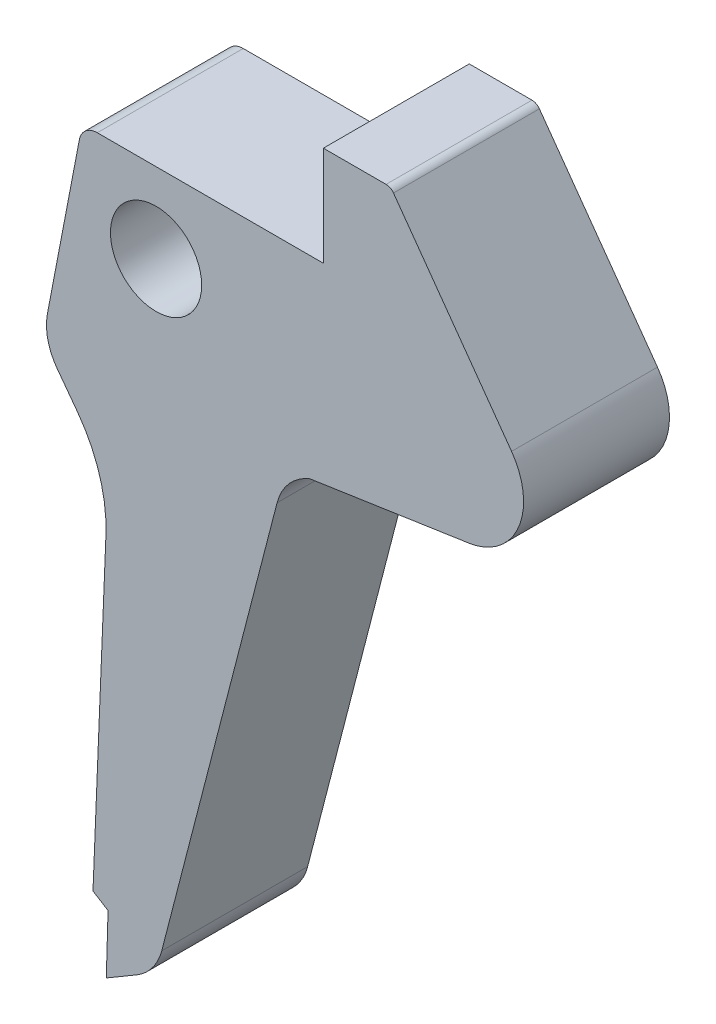
ISO-10303-21;
HEADER;
FILE_DESCRIPTION(('STEP AP214'),'2;1');
FILE_NAME('part.step','',(''),(''),'','','');
FILE_SCHEMA(('AUTOMOTIVE_DESIGN { 1 0 10303 214 1 1 1 1 }'));
ENDSEC;
DATA;
#1=APPLICATION_CONTEXT('core data for automotive mechanical design processes');
#2=APPLICATION_PROTOCOL_DEFINITION('international standard','automotive_design',2000,#1);
#3=PRODUCT_CONTEXT('',#1,'mechanical');
#4=PRODUCT('Part','Part','',(#3));
#5=PRODUCT_RELATED_PRODUCT_CATEGORY('part','',(#4));
#6=PRODUCT_DEFINITION_FORMATION('','',#4);
#7=PRODUCT_DEFINITION_CONTEXT('part definition',#1,'design');
#8=PRODUCT_DEFINITION('design','',#6,#7);
#9=PRODUCT_DEFINITION_SHAPE('','',#8);
#10=(LENGTH_UNIT() NAMED_UNIT(*) SI_UNIT(.MILLI.,.METRE.));
#11=(NAMED_UNIT(*) PLANE_ANGLE_UNIT() SI_UNIT($,.RADIAN.));
#12=(NAMED_UNIT(*) SI_UNIT($,.STERADIAN.) SOLID_ANGLE_UNIT());
#13=UNCERTAINTY_MEASURE_WITH_UNIT(LENGTH_MEASURE(1.E-05),#10,'distance_accuracy_value','');
#14=(GEOMETRIC_REPRESENTATION_CONTEXT(3) GLOBAL_UNCERTAINTY_ASSIGNED_CONTEXT((#13)) GLOBAL_UNIT_ASSIGNED_CONTEXT((#10,
#11,#12)) REPRESENTATION_CONTEXT('',''));
#15=CARTESIAN_POINT('',(0.,0.,0.));
#16=DIRECTION('',(0.,0.,1.));
#17=DIRECTION('',(1.,0.,0.));
#18=AXIS2_PLACEMENT_3D('',#15,#16,#17);
#19=CARTESIAN_POINT('',(-27.5386496965581,20.5124527591258,8.));
#20=DIRECTION('',(0.,0.,-1.));
#21=DIRECTION('',(-1.,0.,0.));
#22=AXIS2_PLACEMENT_3D('',#19,#20,#21);
#23=CYLINDRICAL_SURFACE('',#22,3.51622024287723);
#24=CARTESIAN_POINT('',(-27.0186324334958,17.0348980374087,3.44779673254734));
#25=CARTESIAN_POINT('',(-27.0031138732111,17.0372310651788,3.50906492681584));
#26=CARTESIAN_POINT('',(-26.9901875644307,17.039258326073,3.57100285618573));
#27=CARTESIAN_POINT('',(-26.9695834994203,17.0425679286272,3.69578846759355));
#28=CARTESIAN_POINT('',(-26.9619076690804,17.0438499969226,3.75863647482813));
#29=CARTESIAN_POINT('',(-26.9519837782461,17.0455165090996,3.88346269906473));
#30=CARTESIAN_POINT('',(-26.9496267500831,17.0459189682313,3.94543202422761));
#31=CARTESIAN_POINT('',(-26.9500339387754,17.0458497223223,4.0693246993472));
#32=CARTESIAN_POINT('',(-26.9527957353733,17.0453784304042,4.1312480571897));
#33=CARTESIAN_POINT('',(-26.9632939928981,17.0436197134707,4.2532132957871));
#34=CARTESIAN_POINT('',(-26.9709138009196,17.0423514360426,4.31326554481595));
#35=CARTESIAN_POINT('',(-26.991060045547,17.0391206572248,4.43315978042355));
#36=CARTESIAN_POINT('',(-27.0036362392181,17.0371511360571,4.49299322207267));
#37=CARTESIAN_POINT('',(-27.0186324334958,17.0348980374087,4.55220326745266));
#38=B_SPLINE_CURVE_WITH_KNOTS('',3,(#24,#25,#26,#27,#28,#29,#30,#31,#32,#33,#34,#35,#36,#37),
.UNSPECIFIED.,.F.,.F.,(4,2,2,2,2,2,4),(0.,0.189684137179738,0.379437813770707,0.565267233862551,
0.751008813421791,0.932450136246781,1.11576134286116),.UNSPECIFIED.);
#39=CARTESIAN_POINT('',(-27.0186324334958,17.0348980374087,3.4477967325474));
#40=VERTEX_POINT('',#39);
#41=CARTESIAN_POINT('',(-27.0186324334958,17.0348980374087,4.55220326745266));
#42=VERTEX_POINT('',#41);
#43=EDGE_CURVE('E297',#40,#42,#38,.T.);
#44=ORIENTED_EDGE('',*,*,#43,.F.);
#45=DIRECTION('',(0.,0.,-1.));
#46=VECTOR('',#45,1.);
#47=CARTESIAN_POINT('',(-27.0186324334958,17.0348980374087,8.));
#48=LINE('',#47,#46);
#49=CARTESIAN_POINT('',(-27.0186324334958,17.0348980374087,0.));
#50=VERTEX_POINT('',#49);
#51=EDGE_CURVE('E252',#40,#50,#48,.T.);
#52=ORIENTED_EDGE('',*,*,#51,.T.);
#53=CARTESIAN_POINT('',(-27.5386496965581,20.5124527591258,0.));
#54=DIRECTION('',(0.,0.,1.));
#55=DIRECTION('',(1.,0.,0.));
#56=AXIS2_PLACEMENT_3D('',#53,#54,#55);
#57=CIRCLE('',#56,3.51622024287723);
#58=CARTESIAN_POINT('',(-24.6810608376861,22.5613526371263,0.));
#59=VERTEX_POINT('',#58);
#60=EDGE_CURVE('E242',#50,#59,#57,.T.);
#61=ORIENTED_EDGE('',*,*,#60,.T.);
#62=DIRECTION('',(0.,0.,-1.));
#63=VECTOR('',#62,1.);
#64=CARTESIAN_POINT('',(-24.6810608376861,22.5613526371263,8.));
#65=LINE('',#64,#63);
#66=CARTESIAN_POINT('',(-24.6810608376861,22.5613526371263,8.));
#67=VERTEX_POINT('',#66);
#68=EDGE_CURVE('E200',#67,#59,#65,.T.);
#69=ORIENTED_EDGE('',*,*,#68,.F.);
#70=CARTESIAN_POINT('',(-27.5386496965581,20.5124527591258,8.));
#71=DIRECTION('',(0.,0.,1.));
#72=DIRECTION('',(1.,0.,0.));
#73=AXIS2_PLACEMENT_3D('',#70,#71,#72);
#74=CIRCLE('',#73,3.51622024287723);
#75=CARTESIAN_POINT('',(-27.0186324334958,17.0348980374087,8.));
#76=VERTEX_POINT('',#75);
#77=EDGE_CURVE('E188',#76,#67,#74,.T.);
#78=ORIENTED_EDGE('',*,*,#77,.F.);
#79=EDGE_CURVE('E253',#76,#42,#48,.T.);
#80=ORIENTED_EDGE('',*,*,#79,.T.);
#81=EDGE_LOOP('',(#44,#52,#61,#69,#78,#80));
#82=FACE_BOUND('',#81,.T.);
#83=ADVANCED_FACE('F35',(#82),#23,.T.);
#84=CARTESIAN_POINT('',(-31.5622031088188,31.3003669545744,8.));
#85=DIRECTION('',(0.,0.,1.));
#86=DIRECTION('',(1.,0.,0.));
#87=AXIS2_PLACEMENT_3D('',#84,#85,#86);
#88=PLANE('',#87);
#89=DIRECTION('',(0.,-1.,0.));
#90=VECTOR('',#89,1.);
#91=CARTESIAN_POINT('',(-35.0008358346746,26.3358212656036,8.));
#92=LINE('',#91,#90);
#93=CARTESIAN_POINT('',(-35.0008358346746,31.8003669545744,8.));
#94=VERTEX_POINT('',#93);
#95=CARTESIAN_POINT('',(-35.0008358346746,26.3358212656036,8.));
#96=VERTEX_POINT('',#95);
#97=EDGE_CURVE('E248',#94,#96,#92,.T.);
#98=ORIENTED_EDGE('',*,*,#97,.T.);
#99=DIRECTION('',(-1.,0.,0.));
#100=VECTOR('',#99,1.);
#101=CARTESIAN_POINT('',(-47.3957580318435,26.3358212656036,8.));
#102=LINE('',#101,#100);
#103=CARTESIAN_POINT('',(-47.3957580318435,26.3358212656036,8.));
#104=VERTEX_POINT('',#103);
#105=EDGE_CURVE('E133',#96,#104,#102,.T.);
#106=ORIENTED_EDGE('',*,*,#105,.T.);
#107=CARTESIAN_POINT('',(-47.3957580318435,25.3358212656036,8.));
#108=DIRECTION('',(0.,0.,1.));
#109=DIRECTION('',(-1.,0.,0.));
#110=AXIS2_PLACEMENT_3D('',#107,#108,#109);
#111=CIRCLE('',#110,1.);
#112=CARTESIAN_POINT('',(-48.3778873221714,25.5240287497269,8.));
#113=VERTEX_POINT('',#112);
#114=EDGE_CURVE('E376',#104,#113,#111,.T.);
#115=ORIENTED_EDGE('',*,*,#114,.T.);
#116=DIRECTION('',(-0.188207484123293,-0.982129290327898,0.));
#117=VECTOR('',#116,1.);
#118=CARTESIAN_POINT('',(-50.1299712502546,16.3810716941188,8.));
#119=LINE('',#118,#117);
#120=CARTESIAN_POINT('',(-50.1299712502546,16.3810716941188,8.));
#121=VERTEX_POINT('',#120);
#122=EDGE_CURVE('E374',#113,#121,#119,.T.);
#123=ORIENTED_EDGE('',*,*,#122,.T.);
#124=CARTESIAN_POINT('',(-47.1835833792709,15.816449241749,8.));
#125=DIRECTION('',(0.,0.,1.));
#126=DIRECTION('',(1.,0.,0.));
#127=AXIS2_PLACEMENT_3D('',#124,#125,#126);
#128=CIRCLE('',#127,3.);
#129=CARTESIAN_POINT('',(-49.5888436325412,14.0234843469341,8.));
#130=VERTEX_POINT('',#129);
#131=EDGE_CURVE('E372',#121,#130,#128,.T.);
#132=ORIENTED_EDGE('',*,*,#131,.T.);
#133=DIRECTION('',(0.597654964938284,-0.801753417756743,0.));
#134=VECTOR('',#133,1.);
#135=CARTESIAN_POINT('',(-48.5024211660002,12.5660499127253,8.));
#136=LINE('',#135,#134);
#137=CARTESIAN_POINT('',(-48.5024211660002,12.5660499127253,8.));
#138=VERTEX_POINT('',#137);
#139=EDGE_CURVE('E370',#130,#138,#136,.T.);
#140=ORIENTED_EDGE('',*,*,#139,.T.);
#141=CARTESIAN_POINT('',(-54.9164485080541,7.78481019321899,8.));
#142=DIRECTION('',(0.,0.,-1.));
#143=DIRECTION('',(1.,0.,0.));
#144=AXIS2_PLACEMENT_3D('',#141,#142,#143);
#145=CIRCLE('',#144,8.);
#146=CARTESIAN_POINT('',(-46.9232095093678,7.45597845831508,8.));
#147=VERTEX_POINT('',#146);
#148=EDGE_CURVE('E368',#138,#147,#145,.T.);
#149=ORIENTED_EDGE('',*,*,#148,.T.);
#150=DIRECTION('',(-0.0411039668629871,-0.999154874835792,0.));
#151=VECTOR('',#150,1.);
#152=CARTESIAN_POINT('',(-47.6327122192142,-9.79060734239905,8.));
#153=LINE('',#152,#151);
#154=CARTESIAN_POINT('',(-47.6327122192142,-9.79060734239905,8.));
#155=VERTEX_POINT('',#154);
#156=EDGE_CURVE('E366',#147,#155,#153,.T.);
#157=ORIENTED_EDGE('',*,*,#156,.T.);
#158=DIRECTION('',(0.849229113679136,-0.528024537762923,0.));
#159=VECTOR('',#158,1.);
#160=CARTESIAN_POINT('',(-46.8065771363626,-10.3042727222429,8.));
#161=LINE('',#160,#159);
#162=CARTESIAN_POINT('',(-46.8065771363626,-10.3042727222429,8.));
#163=VERTEX_POINT('',#162);
#164=EDGE_CURVE('E364',#155,#163,#161,.T.);
#165=ORIENTED_EDGE('',*,*,#164,.T.);
#166=DIRECTION('',(-0.0295106794911616,-0.99956446505264,0.));
#167=VECTOR('',#166,1.);
#168=CARTESIAN_POINT('',(-46.9025588606,-13.5552965040206,8.));
#169=LINE('',#168,#167);
#170=CARTESIAN_POINT('',(-46.9025588606,-13.5552965040206,8.));
#171=VERTEX_POINT('',#170);
#172=EDGE_CURVE('E362',#163,#171,#169,.T.);
#173=ORIENTED_EDGE('',*,*,#172,.T.);
#174=DIRECTION('',(0.861711984884144,0.507397728716861,0.));
#175=VECTOR('',#174,1.);
#176=CARTESIAN_POINT('',(-45.245148695036,-12.5793716378109,8.));
#177=LINE('',#176,#175);
#178=CARTESIAN_POINT('',(-45.245148695036,-12.5793716378109,8.));
#179=VERTEX_POINT('',#178);
#180=EDGE_CURVE('E360',#171,#179,#177,.T.);
#181=ORIENTED_EDGE('',*,*,#180,.T.);
#182=CARTESIAN_POINT('',(-46.7673418811866,-9.99423568315843,8.));
#183=DIRECTION('',(0.,0.,1.));
#184=DIRECTION('',(-1.,0.,0.));
#185=AXIS2_PLACEMENT_3D('',#182,#183,#184);
#186=CIRCLE('',#185,3.);
#187=CARTESIAN_POINT('',(-43.8630215931597,-10.7458497227794,8.));
#188=VERTEX_POINT('',#187);
#189=EDGE_CURVE('E358',#179,#188,#186,.T.);
#190=ORIENTED_EDGE('',*,*,#189,.T.);
#191=DIRECTION('',(0.250538013206977,0.968106762675636,0.));
#192=VECTOR('',#191,1.);
#193=CARTESIAN_POINT('',(-37.5380285895858,13.6946270825402,8.));
#194=LINE('',#193,#192);
#195=CARTESIAN_POINT('',(-37.5380285895858,13.6946270825402,8.));
#196=VERTEX_POINT('',#195);
#197=EDGE_CURVE('E356',#188,#196,#194,.T.);
#198=ORIENTED_EDGE('',*,*,#197,.T.);
#199=CARTESIAN_POINT('',(-34.6337083015589,12.9430130429193,8.));
#200=DIRECTION('',(0.,0.,-1.));
#201=DIRECTION('',(-1.,0.,0.));
#202=AXIS2_PLACEMENT_3D('',#199,#200,#201);
#203=CIRCLE('',#202,3.);
#204=CARTESIAN_POINT('',(-35.7433756860296,15.7302407508473,8.));
#205=VERTEX_POINT('',#204);
#206=EDGE_CURVE('E352',#196,#205,#203,.T.);
#207=ORIENTED_EDGE('',*,*,#206,.T.);
#208=DIRECTION('',(0.989003669142037,0.147890981549205,0.));
#209=VECTOR('',#208,1.);
#210=CARTESIAN_POINT('',(-27.0186324334958,17.0348980374087,8.));
#211=LINE('',#210,#209);
#212=EDGE_CURVE('E351',#205,#76,#211,.T.);
#213=ORIENTED_EDGE('',*,*,#212,.T.);
#214=ORIENTED_EDGE('',*,*,#77,.T.);
#215=DIRECTION('',(-0.582699528606273,0.812687676393599,0.));
#216=VECTOR('',#215,1.);
#217=CARTESIAN_POINT('',(-24.6810608376862,22.5613526371262,8.));
#218=LINE('',#217,#216);
#219=CARTESIAN_POINT('',(-31.155859270622,31.5917167188775,8.));
#220=VERTEX_POINT('',#219);
#221=EDGE_CURVE('E180',#67,#220,#218,.T.);
#222=ORIENTED_EDGE('',*,*,#221,.T.);
#223=CARTESIAN_POINT('',(-31.5622031088188,31.3003669545744,8.));
#224=DIRECTION('',(0.,0.,1.));
#225=DIRECTION('',(1.,0.,0.));
#226=AXIS2_PLACEMENT_3D('',#223,#224,#225);
#227=CIRCLE('',#226,0.499999999999996);
#228=CARTESIAN_POINT('',(-31.5622031088188,31.8003669545744,8.));
#229=VERTEX_POINT('',#228);
#230=EDGE_CURVE('E185',#220,#229,#227,.T.);
#231=ORIENTED_EDGE('',*,*,#230,.T.);
#232=DIRECTION('',(-1.,0.,0.));
#233=VECTOR('',#232,1.);
#234=CARTESIAN_POINT('',(-35.0008358346746,31.8003669545744,8.));
#235=LINE('',#234,#233);
#236=EDGE_CURVE('E58',#229,#94,#235,.T.);
#237=ORIENTED_EDGE('',*,*,#236,.T.);
#238=EDGE_LOOP('',(#98,#106,#115,#123,#132,#140,#149,#157,#165,#173,#181,#190,#198,#207,#213,
#214,#222,#231,#237));
#239=FACE_BOUND('',#238,.T.);
#240=CARTESIAN_POINT('',(-44.174350309539,21.9571758004817,8.));
#241=DIRECTION('',(0.,0.,1.));
#242=DIRECTION('',(1.,0.,0.));
#243=AXIS2_PLACEMENT_3D('',#240,#241,#242);
#244=CIRCLE('',#243,2.5);
#245=CARTESIAN_POINT('',(-41.674350309539,21.9571758004817,8.));
#246=VERTEX_POINT('',#245);
#247=EDGE_CURVE('E213',#246,#246,#244,.T.);
#248=ORIENTED_EDGE('',*,*,#247,.F.);
#249=EDGE_LOOP('',(#248));
#250=FACE_BOUND('',#249,.T.);
#251=ADVANCED_FACE('F182',(#239,#250),#88,.T.);
#252=CARTESIAN_POINT('',(-31.5622031088188,31.3003669545744,0.));
#253=DIRECTION('',(0.,0.,1.));
#254=DIRECTION('',(1.,0.,0.));
#255=AXIS2_PLACEMENT_3D('',#252,#253,#254);
#256=PLANE('',#255);
#257=DIRECTION('',(0.,-1.,0.));
#258=VECTOR('',#257,1.);
#259=CARTESIAN_POINT('',(-35.0008358346746,26.3358212656036,0.));
#260=LINE('',#259,#258);
#261=CARTESIAN_POINT('',(-35.0008358346746,31.8003669545744,0.));
#262=VERTEX_POINT('',#261);
#263=CARTESIAN_POINT('',(-35.0008358346746,26.3358212656036,0.));
#264=VERTEX_POINT('',#263);
#265=EDGE_CURVE('E209',#262,#264,#260,.T.);
#266=ORIENTED_EDGE('',*,*,#265,.F.);
#267=DIRECTION('',(-1.,0.,0.));
#268=VECTOR('',#267,1.);
#269=CARTESIAN_POINT('',(-35.0008358346746,31.8003669545744,0.));
#270=LINE('',#269,#268);
#271=CARTESIAN_POINT('',(-31.5622031088188,31.8003669545744,0.));
#272=VERTEX_POINT('',#271);
#273=EDGE_CURVE('E124',#272,#262,#270,.T.);
#274=ORIENTED_EDGE('',*,*,#273,.F.);
#275=CARTESIAN_POINT('',(-31.5622031088188,31.3003669545744,0.));
#276=DIRECTION('',(0.,0.,1.));
#277=DIRECTION('',(1.,0.,0.));
#278=AXIS2_PLACEMENT_3D('',#275,#276,#277);
#279=CIRCLE('',#278,0.499999999999996);
#280=CARTESIAN_POINT('',(-31.155859270622,31.5917167188775,0.));
#281=VERTEX_POINT('',#280);
#282=EDGE_CURVE('E245',#281,#272,#279,.T.);
#283=ORIENTED_EDGE('',*,*,#282,.F.);
#284=DIRECTION('',(-0.582699528606273,0.812687676393599,0.));
#285=VECTOR('',#284,1.);
#286=CARTESIAN_POINT('',(-24.6810608376862,22.5613526371262,0.));
#287=LINE('',#286,#285);
#288=EDGE_CURVE('E197',#59,#281,#287,.T.);
#289=ORIENTED_EDGE('',*,*,#288,.F.);
#290=ORIENTED_EDGE('',*,*,#60,.F.);
#291=DIRECTION('',(0.989003669142037,0.147890981549205,0.));
#292=VECTOR('',#291,1.);
#293=CARTESIAN_POINT('',(-27.0186324334958,17.0348980374087,0.));
#294=LINE('',#293,#292);
#295=CARTESIAN_POINT('',(-35.7433756860296,15.7302407508473,0.));
#296=VERTEX_POINT('',#295);
#297=EDGE_CURVE('E239',#296,#50,#294,.T.);
#298=ORIENTED_EDGE('',*,*,#297,.F.);
#299=CARTESIAN_POINT('',(-34.6337083015589,12.9430130429193,0.));
#300=DIRECTION('',(0.,0.,-1.));
#301=DIRECTION('',(-1.,0.,0.));
#302=AXIS2_PLACEMENT_3D('',#299,#300,#301);
#303=CIRCLE('',#302,3.);
#304=CARTESIAN_POINT('',(-37.5380285895858,13.6946270825402,0.));
#305=VERTEX_POINT('',#304);
#306=EDGE_CURVE('E237',#305,#296,#303,.T.);
#307=ORIENTED_EDGE('',*,*,#306,.F.);
#308=DIRECTION('',(0.250538013206977,0.968106762675636,0.));
#309=VECTOR('',#308,1.);
#310=CARTESIAN_POINT('',(-37.5380285895858,13.6946270825402,0.));
#311=LINE('',#310,#309);
#312=CARTESIAN_POINT('',(-43.8630215931597,-10.7458497227794,0.));
#313=VERTEX_POINT('',#312);
#314=EDGE_CURVE('E235',#313,#305,#311,.T.);
#315=ORIENTED_EDGE('',*,*,#314,.F.);
#316=CARTESIAN_POINT('',(-46.7673418811866,-9.99423568315843,0.));
#317=DIRECTION('',(0.,0.,1.));
#318=DIRECTION('',(-1.,0.,0.));
#319=AXIS2_PLACEMENT_3D('',#316,#317,#318);
#320=CIRCLE('',#319,3.);
#321=CARTESIAN_POINT('',(-45.245148695036,-12.5793716378109,0.));
#322=VERTEX_POINT('',#321);
#323=EDGE_CURVE('E233',#322,#313,#320,.T.);
#324=ORIENTED_EDGE('',*,*,#323,.F.);
#325=DIRECTION('',(0.861711984884144,0.507397728716861,0.));
#326=VECTOR('',#325,1.);
#327=CARTESIAN_POINT('',(-45.245148695036,-12.5793716378109,0.));
#328=LINE('',#327,#326);
#329=CARTESIAN_POINT('',(-46.9025588606,-13.5552965040206,0.));
#330=VERTEX_POINT('',#329);
#331=EDGE_CURVE('E231',#330,#322,#328,.T.);
#332=ORIENTED_EDGE('',*,*,#331,.F.);
#333=DIRECTION('',(-0.0295106794911616,-0.99956446505264,0.));
#334=VECTOR('',#333,1.);
#335=CARTESIAN_POINT('',(-46.9025588606,-13.5552965040206,0.));
#336=LINE('',#335,#334);
#337=CARTESIAN_POINT('',(-46.8065771363626,-10.3042727222429,0.));
#338=VERTEX_POINT('',#337);
#339=EDGE_CURVE('E229',#338,#330,#336,.T.);
#340=ORIENTED_EDGE('',*,*,#339,.F.);
#341=DIRECTION('',(0.849229113679136,-0.528024537762923,0.));
#342=VECTOR('',#341,1.);
#343=CARTESIAN_POINT('',(-46.8065771363626,-10.3042727222429,0.));
#344=LINE('',#343,#342);
#345=CARTESIAN_POINT('',(-47.6327122192142,-9.79060734239905,0.));
#346=VERTEX_POINT('',#345);
#347=EDGE_CURVE('E227',#346,#338,#344,.T.);
#348=ORIENTED_EDGE('',*,*,#347,.F.);
#349=DIRECTION('',(-0.0411039668629871,-0.999154874835792,0.));
#350=VECTOR('',#349,1.);
#351=CARTESIAN_POINT('',(-47.6327122192142,-9.79060734239905,0.));
#352=LINE('',#351,#350);
#353=CARTESIAN_POINT('',(-46.9232095093678,7.45597845831508,0.));
#354=VERTEX_POINT('',#353);
#355=EDGE_CURVE('E225',#354,#346,#352,.T.);
#356=ORIENTED_EDGE('',*,*,#355,.F.);
#357=CARTESIAN_POINT('',(-54.9164485080541,7.78481019321899,0.));
#358=DIRECTION('',(0.,0.,-1.));
#359=DIRECTION('',(1.,0.,0.));
#360=AXIS2_PLACEMENT_3D('',#357,#358,#359);
#361=CIRCLE('',#360,8.);
#362=CARTESIAN_POINT('',(-48.5024211660002,12.5660499127253,0.));
#363=VERTEX_POINT('',#362);
#364=EDGE_CURVE('E223',#363,#354,#361,.T.);
#365=ORIENTED_EDGE('',*,*,#364,.F.);
#366=DIRECTION('',(0.597654964938284,-0.801753417756743,0.));
#367=VECTOR('',#366,1.);
#368=CARTESIAN_POINT('',(-48.5024211660002,12.5660499127253,0.));
#369=LINE('',#368,#367);
#370=CARTESIAN_POINT('',(-49.5888436325412,14.0234843469341,0.));
#371=VERTEX_POINT('',#370);
#372=EDGE_CURVE('E221',#371,#363,#369,.T.);
#373=ORIENTED_EDGE('',*,*,#372,.F.);
#374=CARTESIAN_POINT('',(-47.1835833792709,15.816449241749,0.));
#375=DIRECTION('',(0.,0.,1.));
#376=DIRECTION('',(1.,0.,0.));
#377=AXIS2_PLACEMENT_3D('',#374,#375,#376);
#378=CIRCLE('',#377,3.);
#379=CARTESIAN_POINT('',(-50.1299712502546,16.3810716941188,0.));
#380=VERTEX_POINT('',#379);
#381=EDGE_CURVE('E219',#380,#371,#378,.T.);
#382=ORIENTED_EDGE('',*,*,#381,.F.);
#383=DIRECTION('',(-0.188207484123293,-0.982129290327898,0.));
#384=VECTOR('',#383,1.);
#385=CARTESIAN_POINT('',(-50.1299712502546,16.3810716941188,0.));
#386=LINE('',#385,#384);
#387=CARTESIAN_POINT('',(-48.3778873221714,25.5240287497269,0.));
#388=VERTEX_POINT('',#387);
#389=EDGE_CURVE('E217',#388,#380,#386,.T.);
#390=ORIENTED_EDGE('',*,*,#389,.F.);
#391=CARTESIAN_POINT('',(-47.3957580318435,25.3358212656036,0.));
#392=DIRECTION('',(0.,0.,1.));
#393=DIRECTION('',(-1.,0.,0.));
#394=AXIS2_PLACEMENT_3D('',#391,#392,#393);
#395=CIRCLE('',#394,1.);
#396=CARTESIAN_POINT('',(-47.3957580318435,26.3358212656036,0.));
#397=VERTEX_POINT('',#396);
#398=EDGE_CURVE('E215',#397,#388,#395,.T.);
#399=ORIENTED_EDGE('',*,*,#398,.F.);
#400=DIRECTION('',(-1.,0.,0.));
#401=VECTOR('',#400,1.);
#402=CARTESIAN_POINT('',(-47.3957580318435,26.3358212656036,0.));
#403=LINE('',#402,#401);
#404=EDGE_CURVE('E212',#264,#397,#403,.T.);
#405=ORIENTED_EDGE('',*,*,#404,.F.);
#406=EDGE_LOOP('',(#266,#274,#283,#289,#290,#298,#307,#315,#324,#332,#340,#348,#356,#365,#373,
#382,#390,#399,#405));
#407=FACE_BOUND('',#406,.T.);
#408=CARTESIAN_POINT('',(-44.174350309539,21.9571758004817,0.));
#409=DIRECTION('',(0.,0.,1.));
#410=DIRECTION('',(1.,0.,0.));
#411=AXIS2_PLACEMENT_3D('',#408,#409,#410);
#412=CIRCLE('',#411,2.5);
#413=CARTESIAN_POINT('',(-41.674350309539,21.9571758004817,0.));
#414=VERTEX_POINT('',#413);
#415=EDGE_CURVE('E380',#414,#414,#412,.T.);
#416=ORIENTED_EDGE('',*,*,#415,.T.);
#417=EDGE_LOOP('',(#416));
#418=FACE_BOUND('',#417,.T.);
#419=ADVANCED_FACE('F323',(#407,#418),#256,.F.);
#420=CARTESIAN_POINT('',(-35.0008358346746,26.3358212656036,8.));
#421=DIRECTION('',(1.,0.,0.));
#422=DIRECTION('',(0.,0.,-1.));
#423=AXIS2_PLACEMENT_3D('',#420,#421,#422);
#424=PLANE('',#423);
#425=ORIENTED_EDGE('',*,*,#265,.T.);
#426=DIRECTION('',(0.,0.,-1.));
#427=VECTOR('',#426,1.);
#428=CARTESIAN_POINT('',(-35.0008358346746,26.3358212656036,8.));
#429=LINE('',#428,#427);
#430=EDGE_CURVE('E295',#96,#264,#429,.T.);
#431=ORIENTED_EDGE('',*,*,#430,.F.);
#432=ORIENTED_EDGE('',*,*,#97,.F.);
#433=DIRECTION('',(0.,0.,-1.));
#434=VECTOR('',#433,1.);
#435=CARTESIAN_POINT('',(-35.0008358346746,31.8003669545744,8.));
#436=LINE('',#435,#434);
#437=EDGE_CURVE('E205',#94,#262,#436,.T.);
#438=ORIENTED_EDGE('',*,*,#437,.T.);
#439=EDGE_LOOP('',(#425,#431,#432,#438));
#440=FACE_BOUND('',#439,.T.);
#441=ADVANCED_FACE('F326',(#440),#424,.F.);
#442=CARTESIAN_POINT('',(-47.3957580318435,26.3358212656036,8.));
#443=DIRECTION('',(0.,-1.,0.));
#444=DIRECTION('',(0.,0.,-1.));
#445=AXIS2_PLACEMENT_3D('',#442,#443,#444);
#446=PLANE('',#445);
#447=ORIENTED_EDGE('',*,*,#404,.T.);
#448=DIRECTION('',(0.,0.,-1.));
#449=VECTOR('',#448,1.);
#450=CARTESIAN_POINT('',(-47.3957580318435,26.3358212656036,8.));
#451=LINE('',#450,#449);
#452=EDGE_CURVE('E292',#104,#397,#451,.T.);
#453=ORIENTED_EDGE('',*,*,#452,.F.);
#454=ORIENTED_EDGE('',*,*,#105,.F.);
#455=ORIENTED_EDGE('',*,*,#430,.T.);
#456=EDGE_LOOP('',(#447,#453,#454,#455));
#457=FACE_BOUND('',#456,.T.);
#458=ADVANCED_FACE('F579',(#457),#446,.F.);
#459=CARTESIAN_POINT('',(-47.3957580318435,25.3358212656036,8.));
#460=DIRECTION('',(0.,0.,-1.));
#461=DIRECTION('',(-1.,0.,0.));
#462=AXIS2_PLACEMENT_3D('',#459,#460,#461);
#463=CYLINDRICAL_SURFACE('',#462,1.);
#464=ORIENTED_EDGE('',*,*,#398,.T.);
#465=DIRECTION('',(0.,0.,-1.));
#466=VECTOR('',#465,1.);
#467=CARTESIAN_POINT('',(-48.3778873221714,25.5240287497269,8.));
#468=LINE('',#467,#466);
#469=EDGE_CURVE('E289',#113,#388,#468,.T.);
#470=ORIENTED_EDGE('',*,*,#469,.F.);
#471=ORIENTED_EDGE('',*,*,#114,.F.);
#472=ORIENTED_EDGE('',*,*,#452,.T.);
#473=EDGE_LOOP('',(#464,#470,#471,#472));
#474=FACE_BOUND('',#473,.T.);
#475=ADVANCED_FACE('F569',(#474),#463,.T.);
#476=CARTESIAN_POINT('',(-50.1299712502546,16.3810716941188,8.));
#477=DIRECTION('',(0.982129290327898,-0.188207484123293,0.));
#478=DIRECTION('',(0.188207484123293,0.982129290327898,0.));
#479=AXIS2_PLACEMENT_3D('',#476,#477,#478);
#480=PLANE('',#479);
#481=ORIENTED_EDGE('',*,*,#389,.T.);
#482=DIRECTION('',(0.,0.,-1.));
#483=VECTOR('',#482,1.);
#484=CARTESIAN_POINT('',(-50.1299712502546,16.3810716941188,8.));
#485=LINE('',#484,#483);
#486=EDGE_CURVE('E286',#121,#380,#485,.T.);
#487=ORIENTED_EDGE('',*,*,#486,.F.);
#488=ORIENTED_EDGE('',*,*,#122,.F.);
#489=ORIENTED_EDGE('',*,*,#469,.T.);
#490=EDGE_LOOP('',(#481,#487,#488,#489));
#491=FACE_BOUND('',#490,.T.);
#492=ADVANCED_FACE('F559',(#491),#480,.F.);
#493=CARTESIAN_POINT('',(-47.1835833792709,15.816449241749,8.));
#494=DIRECTION('',(0.,0.,-1.));
#495=DIRECTION('',(-1.,0.,0.));
#496=AXIS2_PLACEMENT_3D('',#493,#494,#495);
#497=CYLINDRICAL_SURFACE('',#496,3.);
#498=ORIENTED_EDGE('',*,*,#381,.T.);
#499=DIRECTION('',(0.,0.,-1.));
#500=VECTOR('',#499,1.);
#501=CARTESIAN_POINT('',(-49.5888436325412,14.0234843469341,8.));
#502=LINE('',#501,#500);
#503=EDGE_CURVE('E283',#130,#371,#502,.T.);
#504=ORIENTED_EDGE('',*,*,#503,.F.);
#505=ORIENTED_EDGE('',*,*,#131,.F.);
#506=ORIENTED_EDGE('',*,*,#486,.T.);
#507=EDGE_LOOP('',(#498,#504,#505,#506));
#508=FACE_BOUND('',#507,.T.);
#509=ADVANCED_FACE('F549',(#508),#497,.T.);
#510=CARTESIAN_POINT('',(-48.5024211660002,12.5660499127253,8.));
#511=DIRECTION('',(0.801753417756743,0.597654964938284,0.));
#512=DIRECTION('',(-0.597654964938284,0.801753417756743,0.));
#513=AXIS2_PLACEMENT_3D('',#510,#511,#512);
#514=PLANE('',#513);
#515=ORIENTED_EDGE('',*,*,#372,.T.);
#516=DIRECTION('',(0.,0.,-1.));
#517=VECTOR('',#516,1.);
#518=CARTESIAN_POINT('',(-48.5024211660002,12.5660499127253,8.));
#519=LINE('',#518,#517);
#520=EDGE_CURVE('E280',#138,#363,#519,.T.);
#521=ORIENTED_EDGE('',*,*,#520,.F.);
#522=ORIENTED_EDGE('',*,*,#139,.F.);
#523=ORIENTED_EDGE('',*,*,#503,.T.);
#524=EDGE_LOOP('',(#515,#521,#522,#523));
#525=FACE_BOUND('',#524,.T.);
#526=ADVANCED_FACE('F539',(#525),#514,.F.);
#527=CARTESIAN_POINT('',(-54.9164485080541,7.78481019321899,8.));
#528=DIRECTION('',(0.,0.,-1.));
#529=DIRECTION('',(-1.,0.,0.));
#530=AXIS2_PLACEMENT_3D('',#527,#528,#529);
#531=CYLINDRICAL_SURFACE('',#530,8.);
#532=ORIENTED_EDGE('',*,*,#364,.T.);
#533=DIRECTION('',(0.,0.,-1.));
#534=VECTOR('',#533,1.);
#535=CARTESIAN_POINT('',(-46.9232095093678,7.45597845831508,8.));
#536=LINE('',#535,#534);
#537=EDGE_CURVE('E277',#147,#354,#536,.T.);
#538=ORIENTED_EDGE('',*,*,#537,.F.);
#539=ORIENTED_EDGE('',*,*,#148,.F.);
#540=ORIENTED_EDGE('',*,*,#520,.T.);
#541=EDGE_LOOP('',(#532,#538,#539,#540));
#542=FACE_BOUND('',#541,.T.);
#543=ADVANCED_FACE('F529',(#542),#531,.F.);
#544=CARTESIAN_POINT('',(-47.6327122192142,-9.79060734239905,8.));
#545=DIRECTION('',(0.999154874835792,-0.0411039668629871,0.));
#546=DIRECTION('',(0.0411039668629871,0.999154874835792,0.));
#547=AXIS2_PLACEMENT_3D('',#544,#545,#546);
#548=PLANE('',#547);
#549=ORIENTED_EDGE('',*,*,#355,.T.);
#550=DIRECTION('',(0.,0.,-1.));
#551=VECTOR('',#550,1.);
#552=CARTESIAN_POINT('',(-47.6327122192142,-9.79060734239905,8.));
#553=LINE('',#552,#551);
#554=EDGE_CURVE('E274',#155,#346,#553,.T.);
#555=ORIENTED_EDGE('',*,*,#554,.F.);
#556=ORIENTED_EDGE('',*,*,#156,.F.);
#557=ORIENTED_EDGE('',*,*,#537,.T.);
#558=EDGE_LOOP('',(#549,#555,#556,#557));
#559=FACE_BOUND('',#558,.T.);
#560=ADVANCED_FACE('F519',(#559),#548,.F.);
#561=CARTESIAN_POINT('',(-46.8065771363626,-10.3042727222429,8.));
#562=DIRECTION('',(0.528024537762923,0.849229113679136,0.));
#563=DIRECTION('',(-0.849229113679136,0.528024537762923,0.));
#564=AXIS2_PLACEMENT_3D('',#561,#562,#563);
#565=PLANE('',#564);
#566=ORIENTED_EDGE('',*,*,#347,.T.);
#567=DIRECTION('',(0.,0.,-1.));
#568=VECTOR('',#567,1.);
#569=CARTESIAN_POINT('',(-46.8065771363626,-10.3042727222429,8.));
#570=LINE('',#569,#568);
#571=EDGE_CURVE('E271',#163,#338,#570,.T.);
#572=ORIENTED_EDGE('',*,*,#571,.F.);
#573=ORIENTED_EDGE('',*,*,#164,.F.);
#574=ORIENTED_EDGE('',*,*,#554,.T.);
#575=EDGE_LOOP('',(#566,#572,#573,#574));
#576=FACE_BOUND('',#575,.T.);
#577=ADVANCED_FACE('F509',(#576),#565,.F.);
#578=CARTESIAN_POINT('',(-46.9025588606,-13.5552965040206,8.));
#579=DIRECTION('',(0.99956446505264,-0.0295106794911616,0.));
#580=DIRECTION('',(0.0295106794911616,0.99956446505264,0.));
#581=AXIS2_PLACEMENT_3D('',#578,#579,#580);
#582=PLANE('',#581);
#583=ORIENTED_EDGE('',*,*,#339,.T.);
#584=DIRECTION('',(0.,0.,-1.));
#585=VECTOR('',#584,1.);
#586=CARTESIAN_POINT('',(-46.9025588606,-13.5552965040206,8.));
#587=LINE('',#586,#585);
#588=EDGE_CURVE('E268',#171,#330,#587,.T.);
#589=ORIENTED_EDGE('',*,*,#588,.F.);
#590=ORIENTED_EDGE('',*,*,#172,.F.);
#591=ORIENTED_EDGE('',*,*,#571,.T.);
#592=EDGE_LOOP('',(#583,#589,#590,#591));
#593=FACE_BOUND('',#592,.T.);
#594=ADVANCED_FACE('F499',(#593),#582,.F.);
#595=CARTESIAN_POINT('',(-45.245148695036,-12.5793716378109,8.));
#596=DIRECTION('',(-0.507397728716861,0.861711984884144,0.));
#597=DIRECTION('',(-0.861711984884144,-0.507397728716861,0.));
#598=AXIS2_PLACEMENT_3D('',#595,#596,#597);
#599=PLANE('',#598);
#600=ORIENTED_EDGE('',*,*,#331,.T.);
#601=DIRECTION('',(0.,0.,-1.));
#602=VECTOR('',#601,1.);
#603=CARTESIAN_POINT('',(-45.245148695036,-12.5793716378109,8.));
#604=LINE('',#603,#602);
#605=EDGE_CURVE('E265',#179,#322,#604,.T.);
#606=ORIENTED_EDGE('',*,*,#605,.F.);
#607=ORIENTED_EDGE('',*,*,#180,.F.);
#608=ORIENTED_EDGE('',*,*,#588,.T.);
#609=EDGE_LOOP('',(#600,#606,#607,#608));
#610=FACE_BOUND('',#609,.T.);
#611=ADVANCED_FACE('F489',(#610),#599,.F.);
#612=CARTESIAN_POINT('',(-46.7673418811866,-9.99423568315843,8.));
#613=DIRECTION('',(0.,0.,-1.));
#614=DIRECTION('',(-1.,0.,0.));
#615=AXIS2_PLACEMENT_3D('',#612,#613,#614);
#616=CYLINDRICAL_SURFACE('',#615,3.);
#617=ORIENTED_EDGE('',*,*,#323,.T.);
#618=DIRECTION('',(0.,0.,-1.));
#619=VECTOR('',#618,1.);
#620=CARTESIAN_POINT('',(-43.8630215931597,-10.7458497227794,8.));
#621=LINE('',#620,#619);
#622=EDGE_CURVE('E262',#188,#313,#621,.T.);
#623=ORIENTED_EDGE('',*,*,#622,.F.);
#624=ORIENTED_EDGE('',*,*,#189,.F.);
#625=ORIENTED_EDGE('',*,*,#605,.T.);
#626=EDGE_LOOP('',(#617,#623,#624,#625));
#627=FACE_BOUND('',#626,.T.);
#628=ADVANCED_FACE('F479',(#627),#616,.T.);
#629=CARTESIAN_POINT('',(-37.5380285895858,13.6946270825402,8.));
#630=DIRECTION('',(-0.968106762675636,0.250538013206978,0.));
#631=DIRECTION('',(-0.250538013206978,-0.968106762675636,0.));
#632=AXIS2_PLACEMENT_3D('',#629,#630,#631);
#633=PLANE('',#632);
#634=ORIENTED_EDGE('',*,*,#314,.T.);
#635=DIRECTION('',(0.,0.,-1.));
#636=VECTOR('',#635,1.);
#637=CARTESIAN_POINT('',(-37.5380285895858,13.6946270825402,8.));
#638=LINE('',#637,#636);
#639=EDGE_CURVE('E259',#196,#305,#638,.T.);
#640=ORIENTED_EDGE('',*,*,#639,.F.);
#641=ORIENTED_EDGE('',*,*,#197,.F.);
#642=ORIENTED_EDGE('',*,*,#622,.T.);
#643=EDGE_LOOP('',(#634,#640,#641,#642));
#644=FACE_BOUND('',#643,.T.);
#645=ADVANCED_FACE('F469',(#644),#633,.F.);
#646=CARTESIAN_POINT('',(-34.6337083015589,12.9430130429193,8.));
#647=DIRECTION('',(0.,0.,-1.));
#648=DIRECTION('',(-1.,0.,0.));
#649=AXIS2_PLACEMENT_3D('',#646,#647,#648);
#650=CYLINDRICAL_SURFACE('',#649,3.);
#651=ORIENTED_EDGE('',*,*,#306,.T.);
#652=DIRECTION('',(0.,0.,-1.));
#653=VECTOR('',#652,1.);
#654=CARTESIAN_POINT('',(-35.7433756860296,15.7302407508473,8.));
#655=LINE('',#654,#653);
#656=EDGE_CURVE('E256',#205,#296,#655,.T.);
#657=ORIENTED_EDGE('',*,*,#656,.F.);
#658=ORIENTED_EDGE('',*,*,#206,.F.);
#659=ORIENTED_EDGE('',*,*,#639,.T.);
#660=EDGE_LOOP('',(#651,#657,#658,#659));
#661=FACE_BOUND('',#660,.T.);
#662=ADVANCED_FACE('F336',(#661),#650,.F.);
#663=CARTESIAN_POINT('',(-27.0186324334958,17.0348980374087,8.));
#664=DIRECTION('',(-0.147890981549205,0.989003669142037,0.));
#665=DIRECTION('',(-0.989003669142037,-0.147890981549205,0.));
#666=AXIS2_PLACEMENT_3D('',#663,#664,#665);
#667=PLANE('',#666);
#668=CARTESIAN_POINT('',(-29.1998182466292,16.7087337157683,4.));
#669=DIRECTION('',(-0.147890981549205,0.989003669142037,0.));
#670=DIRECTION('',(-0.989003669142037,-0.147890981549205,0.));
#671=AXIS2_PLACEMENT_3D('',#668,#669,#670);
#672=ELLIPSE('',#671,2.2750168378565,2.25);
#673=EDGE_CURVE('E49',#42,#40,#672,.F.);
#674=ORIENTED_EDGE('',*,*,#673,.F.);
#675=ORIENTED_EDGE('',*,*,#79,.F.);
#676=ORIENTED_EDGE('',*,*,#212,.F.);
#677=ORIENTED_EDGE('',*,*,#656,.T.);
#678=ORIENTED_EDGE('',*,*,#297,.T.);
#679=ORIENTED_EDGE('',*,*,#51,.F.);
#680=EDGE_LOOP('',(#674,#675,#676,#677,#678,#679));
#681=FACE_BOUND('',#680,.T.);
#682=ADVANCED_FACE('F332',(#681),#667,.F.);
#683=CARTESIAN_POINT('',(-24.6810608376862,22.5613526371262,8.));
#684=DIRECTION('',(-0.812687676393599,-0.582699528606273,0.));
#685=DIRECTION('',(0.582699528606273,-0.812687676393599,0.));
#686=AXIS2_PLACEMENT_3D('',#683,#684,#685);
#687=PLANE('',#686);
#688=ORIENTED_EDGE('',*,*,#288,.T.);
#689=DIRECTION('',(0.,0.,-1.));
#690=VECTOR('',#689,1.);
#691=CARTESIAN_POINT('',(-31.155859270622,31.5917167188775,8.));
#692=LINE('',#691,#690);
#693=EDGE_CURVE('E194',#220,#281,#692,.T.);
#694=ORIENTED_EDGE('',*,*,#693,.F.);
#695=ORIENTED_EDGE('',*,*,#221,.F.);
#696=ORIENTED_EDGE('',*,*,#68,.T.);
#697=EDGE_LOOP('',(#688,#694,#695,#696));
#698=FACE_BOUND('',#697,.T.);
#699=ADVANCED_FACE('F195',(#698),#687,.F.);
#700=CARTESIAN_POINT('',(-31.5622031088188,31.3003669545744,8.));
#701=DIRECTION('',(0.,0.,-1.));
#702=DIRECTION('',(-1.,0.,0.));
#703=AXIS2_PLACEMENT_3D('',#700,#701,#702);
#704=CYLINDRICAL_SURFACE('',#703,0.499999999999996);
#705=ORIENTED_EDGE('',*,*,#282,.T.);
#706=DIRECTION('',(0.,0.,-1.));
#707=VECTOR('',#706,1.);
#708=CARTESIAN_POINT('',(-31.5622031088188,31.8003669545744,8.));
#709=LINE('',#708,#707);
#710=EDGE_CURVE('E201',#229,#272,#709,.T.);
#711=ORIENTED_EDGE('',*,*,#710,.F.);
#712=ORIENTED_EDGE('',*,*,#230,.F.);
#713=ORIENTED_EDGE('',*,*,#693,.T.);
#714=EDGE_LOOP('',(#705,#711,#712,#713));
#715=FACE_BOUND('',#714,.T.);
#716=ADVANCED_FACE('F203',(#715),#704,.T.);
#717=CARTESIAN_POINT('',(-35.0008358346746,31.8003669545744,8.));
#718=DIRECTION('',(0.,-1.,0.));
#719=DIRECTION('',(0.,0.,-1.));
#720=AXIS2_PLACEMENT_3D('',#717,#718,#719);
#721=PLANE('',#720);
#722=ORIENTED_EDGE('',*,*,#273,.T.);
#723=ORIENTED_EDGE('',*,*,#437,.F.);
#724=ORIENTED_EDGE('',*,*,#236,.F.);
#725=ORIENTED_EDGE('',*,*,#710,.T.);
#726=EDGE_LOOP('',(#722,#723,#724,#725));
#727=FACE_BOUND('',#726,.T.);
#728=ADVANCED_FACE('F319',(#727),#721,.F.);
#729=CARTESIAN_POINT('',(-44.174350309539,21.9571758004817,8.));
#730=DIRECTION('',(0.,0.,-1.));
#731=DIRECTION('',(-1.,0.,0.));
#732=AXIS2_PLACEMENT_3D('',#729,#730,#731);
#733=CYLINDRICAL_SURFACE('',#732,2.5);
#734=ORIENTED_EDGE('',*,*,#247,.T.);
#735=EDGE_LOOP('',(#734));
#736=FACE_BOUND('',#735,.T.);
#737=ORIENTED_EDGE('',*,*,#415,.F.);
#738=EDGE_LOOP('',(#737));
#739=FACE_BOUND('',#738,.T.);
#740=ADVANCED_FACE('F314',(#736,#739),#733,.F.);
#741=CARTESIAN_POINT('',(-29.1998182466292,19.3358212656036,4.));
#742=DIRECTION('',(0.,-1.,0.));
#743=DIRECTION('',(0.,0.,-1.));
#744=AXIS2_PLACEMENT_3D('',#741,#742,#743);
#745=CYLINDRICAL_SURFACE('',#744,2.25);
#746=CARTESIAN_POINT('',(-29.1998182466292,19.3358212656036,4.));
#747=DIRECTION('',(0.,1.,0.));
#748=DIRECTION('',(0.,0.,1.));
#749=AXIS2_PLACEMENT_3D('',#746,#747,#748);
#750=CIRCLE('',#749,2.25);
#751=CARTESIAN_POINT('',(-29.1998182466292,19.3358212656036,6.25));
#752=VERTEX_POINT('',#751);
#753=EDGE_CURVE('E386',#752,#752,#750,.T.);
#754=ORIENTED_EDGE('',*,*,#753,.T.);
#755=EDGE_LOOP('',(#754));
#756=FACE_BOUND('',#755,.T.);
#757=ORIENTED_EDGE('',*,*,#673,.T.);
#758=ORIENTED_EDGE('',*,*,#43,.T.);
#759=EDGE_LOOP('',(#757,#758));
#760=FACE_BOUND('',#759,.T.);
#761=ADVANCED_FACE('F308',(#756,#760),#745,.F.);
#762=CARTESIAN_POINT('',(-29.1998182466292,19.3358212656036,4.));
#763=DIRECTION('',(0.,1.,0.));
#764=DIRECTION('',(0.,0.,1.));
#765=AXIS2_PLACEMENT_3D('',#762,#763,#764);
#766=PLANE('',#765);
#767=CARTESIAN_POINT('',(-29.1998182466292,19.3358212656036,4.));
#768=DIRECTION('',(0.,1.,0.));
#769=DIRECTION('',(0.,0.,1.));
#770=AXIS2_PLACEMENT_3D('',#767,#768,#769);
#771=CIRCLE('',#770,1.725);
#772=CARTESIAN_POINT('',(-29.1998182466292,19.3358212656036,5.725));
#773=VERTEX_POINT('',#772);
#774=EDGE_CURVE('E304',#773,#773,#771,.F.);
#775=ORIENTED_EDGE('',*,*,#774,.F.);
#776=EDGE_LOOP('',(#775));
#777=FACE_BOUND('',#776,.T.);
#778=ORIENTED_EDGE('',*,*,#753,.F.);
#779=EDGE_LOOP('',(#778));
#780=FACE_BOUND('',#779,.T.);
#781=ADVANCED_FACE('F313',(#777,#780),#766,.F.);
#782=CARTESIAN_POINT('',(-29.1998182466292,15.3358212656036,4.));
#783=DIRECTION('',(0.,1.,0.));
#784=DIRECTION('',(0.,0.,1.));
#785=AXIS2_PLACEMENT_3D('',#782,#783,#784);
#786=CYLINDRICAL_SURFACE('',#785,1.725);
#787=CARTESIAN_POINT('',(-29.1998182466292,16.3358212656036,4.));
#788=DIRECTION('',(0.,-1.,0.));
#789=DIRECTION('',(0.,0.,-1.));
#790=AXIS2_PLACEMENT_3D('',#787,#788,#789);
#791=CIRCLE('',#790,1.725);
#792=CARTESIAN_POINT('',(-29.1998182466292,16.3358212656036,2.275));
#793=VERTEX_POINT('',#792);
#794=EDGE_CURVE('E11',#793,#793,#791,.F.);
#795=ORIENTED_EDGE('',*,*,#794,.T.);
#796=EDGE_LOOP('',(#795));
#797=FACE_BOUND('',#796,.T.);
#798=ORIENTED_EDGE('',*,*,#774,.T.);
#799=EDGE_LOOP('',(#798));
#800=FACE_BOUND('',#799,.T.);
#801=ADVANCED_FACE('F391',(#797,#800),#786,.T.);
#802=CARTESIAN_POINT('',(0.,15.3358212656036,0.));
#803=DIRECTION('',(0.,-1.,0.));
#804=DIRECTION('',(0.,0.,-1.));
#805=AXIS2_PLACEMENT_3D('',#802,#803,#804);
#806=PLANE('',#805);
#807=CARTESIAN_POINT('',(-29.1998182466292,15.3358212656036,4.));
#808=DIRECTION('',(0.,-1.,0.));
#809=DIRECTION('',(0.,0.,-1.));
#810=AXIS2_PLACEMENT_3D('',#807,#808,#809);
#811=CIRCLE('',#810,0.725000000000001);
#812=CARTESIAN_POINT('',(-29.1998182466292,15.3358212656036,3.275));
#813=VERTEX_POINT('',#812);
#814=EDGE_CURVE('E43',#813,#813,#811,.T.);
#815=ORIENTED_EDGE('',*,*,#814,.T.);
#816=EDGE_LOOP('',(#815));
#817=FACE_BOUND('',#816,.T.);
#818=ADVANCED_FACE('F396',(#817),#806,.T.);
#819=CARTESIAN_POINT('',(-29.1998182466292,16.3358212656036,4.));
#820=DIRECTION('',(0.,-1.,0.));
#821=DIRECTION('',(0.,0.,-1.));
#822=AXIS2_PLACEMENT_3D('',#819,#820,#821);
#823=DEGENERATE_TOROIDAL_SURFACE('',#822,0.725000000000001,1.,.T.);
#824=ORIENTED_EDGE('',*,*,#794,.F.);
#825=EDGE_LOOP('',(#824));
#826=FACE_BOUND('',#825,.T.);
#827=ORIENTED_EDGE('',*,*,#814,.F.);
#828=EDGE_LOOP('',(#827));
#829=FACE_BOUND('',#828,.T.);
#830=ADVANCED_FACE('F37',(#826,#829),#823,.T.);
#831=CLOSED_SHELL('',(#83,#251,#419,#441,#458,#475,#492,#509,#526,#543,#560,#577,#594,#611,#628,
#645,#662,#682,#699,#716,#728,#740,#761,#781,#801,#818,#830));
#832=MANIFOLD_SOLID_BREP('B2',#831);
#833=ADVANCED_BREP_SHAPE_REPRESENTATION('',(#18,#832),#14);
#834=SHAPE_DEFINITION_REPRESENTATION(#9,#833);
ENDSEC;
END-ISO-10303-21;
